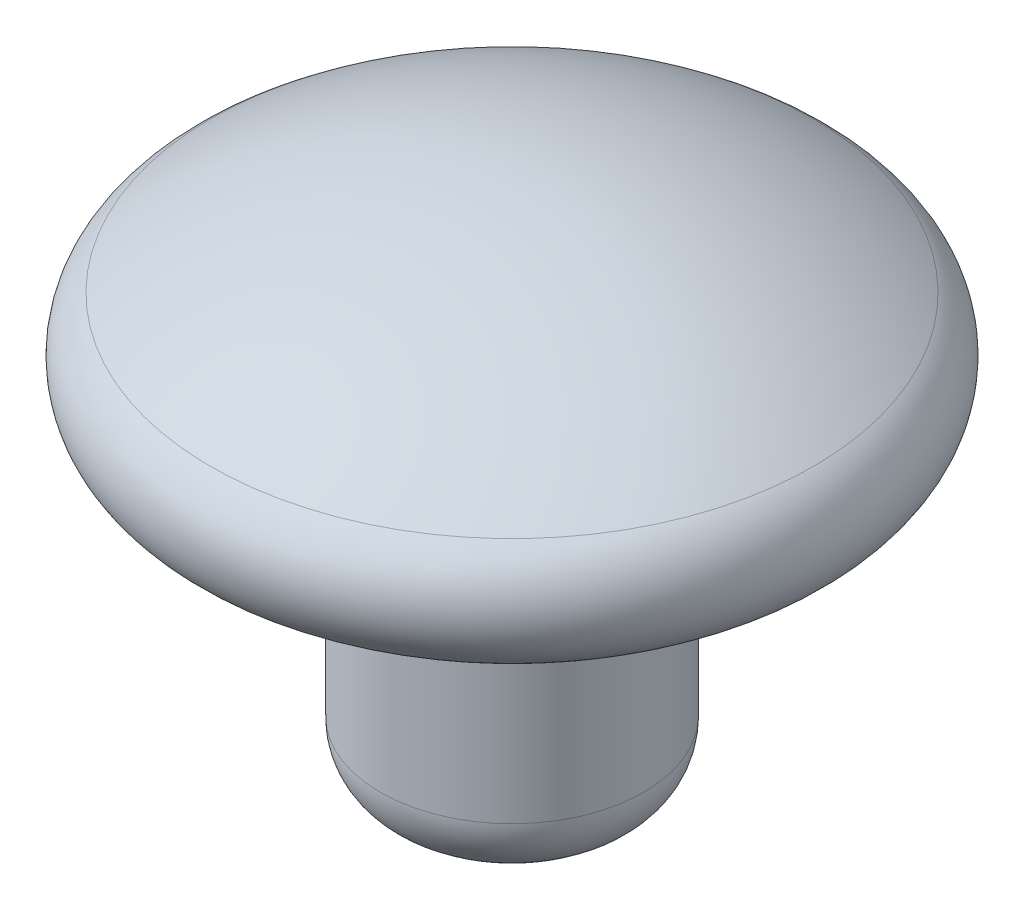
ISO-10303-21;
HEADER;
FILE_DESCRIPTION(('STEP AP214'),'2;1');
FILE_NAME('part.step','',(''),(''),'','','');
FILE_SCHEMA(('AUTOMOTIVE_DESIGN { 1 0 10303 214 1 1 1 1 }'));
ENDSEC;
DATA;
#1=APPLICATION_CONTEXT('core data for automotive mechanical design processes');
#2=APPLICATION_PROTOCOL_DEFINITION('international standard','automotive_design',2000,#1);
#3=PRODUCT_CONTEXT('',#1,'mechanical');
#4=PRODUCT('Part','Part','',(#3));
#5=PRODUCT_RELATED_PRODUCT_CATEGORY('part','',(#4));
#6=PRODUCT_DEFINITION_FORMATION('','',#4);
#7=PRODUCT_DEFINITION_CONTEXT('part definition',#1,'design');
#8=PRODUCT_DEFINITION('design','',#6,#7);
#9=PRODUCT_DEFINITION_SHAPE('','',#8);
#10=(LENGTH_UNIT() NAMED_UNIT(*) SI_UNIT(.MILLI.,.METRE.));
#11=(NAMED_UNIT(*) PLANE_ANGLE_UNIT() SI_UNIT($,.RADIAN.));
#12=(NAMED_UNIT(*) SI_UNIT($,.STERADIAN.) SOLID_ANGLE_UNIT());
#13=UNCERTAINTY_MEASURE_WITH_UNIT(LENGTH_MEASURE(1.E-05),#10,'distance_accuracy_value','');
#14=(GEOMETRIC_REPRESENTATION_CONTEXT(3) GLOBAL_UNCERTAINTY_ASSIGNED_CONTEXT((#13)) GLOBAL_UNIT_ASSIGNED_CONTEXT((#10,
#11,#12)) REPRESENTATION_CONTEXT('',''));
#15=CARTESIAN_POINT('',(0.,0.,0.));
#16=DIRECTION('',(0.,0.,1.));
#17=DIRECTION('',(1.,0.,0.));
#18=AXIS2_PLACEMENT_3D('',#15,#16,#17);
#19=CARTESIAN_POINT('',(0.,0.,0.));
#20=DIRECTION('',(0.,-1.,0.));
#21=DIRECTION('',(0.,0.,-1.));
#22=AXIS2_PLACEMENT_3D('',#19,#20,#21);
#23=CYLINDRICAL_SURFACE('',#22,2.);
#24=CARTESIAN_POINT('',(0.,1.,0.));
#25=DIRECTION('',(0.,-1.,0.));
#26=DIRECTION('',(0.,0.,-1.));
#27=AXIS2_PLACEMENT_3D('',#24,#25,#26);
#28=CIRCLE('',#27,2.);
#29=CARTESIAN_POINT('',(0.,1.,-2.));
#30=VERTEX_POINT('',#29);
#31=EDGE_CURVE('E10',#30,#30,#28,.T.);
#32=ORIENTED_EDGE('',*,*,#31,.F.);
#33=EDGE_LOOP('',(#32));
#34=FACE_BOUND('',#33,.T.);
#35=CARTESIAN_POINT('',(0.,4.01901003570652,0.));
#36=DIRECTION('',(0.,-1.,0.));
#37=DIRECTION('',(0.,0.,-1.));
#38=AXIS2_PLACEMENT_3D('',#35,#36,#37);
#39=CIRCLE('',#38,2.);
#40=CARTESIAN_POINT('',(0.,4.01901003570652,-2.));
#41=VERTEX_POINT('',#40);
#42=EDGE_CURVE('E57',#41,#41,#39,.T.);
#43=ORIENTED_EDGE('',*,*,#42,.T.);
#44=EDGE_LOOP('',(#43));
#45=FACE_BOUND('',#44,.T.);
#46=ADVANCED_FACE('F35',(#34,#45),#23,.T.);
#47=CARTESIAN_POINT('',(0.,1.,0.));
#48=DIRECTION('',(0.,-1.,0.));
#49=DIRECTION('',(0.,0.,-1.));
#50=AXIS2_PLACEMENT_3D('',#47,#48,#49);
#51=DEGENERATE_TOROIDAL_SURFACE('',#50,0.999999999999999,1.,.T.);
#52=CARTESIAN_POINT('',(0.,0.,0.));
#53=DIRECTION('',(0.,-1.,0.));
#54=DIRECTION('',(0.,0.,-1.));
#55=AXIS2_PLACEMENT_3D('',#52,#53,#54);
#56=CIRCLE('',#55,0.999999999999999);
#57=CARTESIAN_POINT('',(0.,0.,-0.999999999999999));
#58=VERTEX_POINT('',#57);
#59=EDGE_CURVE('E41',#58,#58,#56,.T.);
#60=ORIENTED_EDGE('',*,*,#59,.F.);
#61=EDGE_LOOP('',(#60));
#62=FACE_BOUND('',#61,.T.);
#63=ORIENTED_EDGE('',*,*,#31,.T.);
#64=EDGE_LOOP('',(#63));
#65=FACE_BOUND('',#64,.T.);
#66=ADVANCED_FACE('F87',(#62,#65),#51,.T.);
#67=CARTESIAN_POINT('',(0.,0.,0.));
#68=DIRECTION('',(0.,1.,0.));
#69=DIRECTION('',(0.,0.,1.));
#70=AXIS2_PLACEMENT_3D('',#67,#68,#69);
#71=PLANE('',#70);
#72=ORIENTED_EDGE('',*,*,#59,.T.);
#73=EDGE_LOOP('',(#72));
#74=FACE_BOUND('',#73,.T.);
#75=ADVANCED_FACE('F82',(#74),#71,.F.);
#76=CARTESIAN_POINT('',(0.,0.,0.));
#77=DIRECTION('',(0.,-1.,0.));
#78=DIRECTION('',(-1.,0.,0.));
#79=AXIS2_PLACEMENT_3D('',#76,#77,#78);
#80=SPHERICAL_SURFACE('',#79,8.);
#81=CARTESIAN_POINT('',(0.,6.56521445318632,0.));
#82=DIRECTION('',(0.,-1.,0.));
#83=DIRECTION('',(0.,0.,-1.));
#84=AXIS2_PLACEMENT_3D('',#81,#82,#83);
#85=CIRCLE('',#84,4.57142857142857);
#86=CARTESIAN_POINT('',(0.,6.56521445318632,-4.57142857142857));
#87=VERTEX_POINT('',#86);
#88=EDGE_CURVE('E45',#87,#87,#85,.T.);
#89=ORIENTED_EDGE('',*,*,#88,.F.);
#90=EDGE_LOOP('',(#89));
#91=FACE_BOUND('',#90,.T.);
#92=ADVANCED_FACE('F77',(#91),#80,.T.);
#93=CARTESIAN_POINT('',(0.,5.74456264653803,0.));
#94=DIRECTION('',(0.,-1.,0.));
#95=DIRECTION('',(0.,0.,-1.));
#96=AXIS2_PLACEMENT_3D('',#93,#94,#95);
#97=TOROIDAL_SURFACE('',#96,4.,1.);
#98=CARTESIAN_POINT('',(0.,4.75429457779646,0.));
#99=DIRECTION('',(0.,-1.,0.));
#100=DIRECTION('',(0.,0.,-1.));
#101=AXIS2_PLACEMENT_3D('',#98,#99,#100);
#102=CIRCLE('',#101,4.13917310096006);
#103=CARTESIAN_POINT('',(0.,4.75429457779646,-4.13917310096006));
#104=VERTEX_POINT('',#103);
#105=EDGE_CURVE('E49',#104,#104,#102,.T.);
#106=ORIENTED_EDGE('',*,*,#105,.F.);
#107=EDGE_LOOP('',(#106));
#108=FACE_BOUND('',#107,.T.);
#109=ORIENTED_EDGE('',*,*,#88,.T.);
#110=EDGE_LOOP('',(#109));
#111=FACE_BOUND('',#110,.T.);
#112=ADVANCED_FACE('F71',(#108,#111),#97,.T.);
#113=CARTESIAN_POINT('',(0.,4.75429457779646,0.));
#114=DIRECTION('',(0.,1.,0.));
#115=DIRECTION('',(0.,0.,1.));
#116=AXIS2_PLACEMENT_3D('',#113,#114,#115);
#117=CONICAL_SURFACE('',#116,4.13917310096006,1.43116998663535);
#118=CARTESIAN_POINT('',(0.,4.5141440700773,0.));
#119=DIRECTION('',(0.,-1.,0.));
#120=DIRECTION('',(0.,0.,-1.));
#121=AXIS2_PLACEMENT_3D('',#118,#119,#120);
#122=CIRCLE('',#121,2.43041344951997);
#123=CARTESIAN_POINT('',(0.,4.5141440700773,-2.43041344951997));
#124=VERTEX_POINT('',#123);
#125=EDGE_CURVE('E54',#124,#124,#122,.T.);
#126=ORIENTED_EDGE('',*,*,#125,.F.);
#127=EDGE_LOOP('',(#126));
#128=FACE_BOUND('',#127,.T.);
#129=ORIENTED_EDGE('',*,*,#105,.T.);
#130=EDGE_LOOP('',(#129));
#131=FACE_BOUND('',#130,.T.);
#132=ADVANCED_FACE('F65',(#128,#131),#117,.T.);
#133=CARTESIAN_POINT('',(0.,4.01901003570652,0.));
#134=DIRECTION('',(0.,-1.,0.));
#135=DIRECTION('',(0.,0.,-1.));
#136=AXIS2_PLACEMENT_3D('',#133,#134,#135);
#137=TOROIDAL_SURFACE('',#136,2.5,0.5);
#138=ORIENTED_EDGE('',*,*,#42,.F.);
#139=EDGE_LOOP('',(#138));
#140=FACE_BOUND('',#139,.T.);
#141=ORIENTED_EDGE('',*,*,#125,.T.);
#142=EDGE_LOOP('',(#141));
#143=FACE_BOUND('',#142,.T.);
#144=ADVANCED_FACE('F62',(#140,#143),#137,.F.);
#145=CLOSED_SHELL('',(#46,#66,#75,#92,#112,#132,#144));
#146=MANIFOLD_SOLID_BREP('B2',#145);
#147=ADVANCED_BREP_SHAPE_REPRESENTATION('',(#18,#146),#14);
#148=SHAPE_DEFINITION_REPRESENTATION(#9,#147);
ENDSEC;
END-ISO-10303-21;
